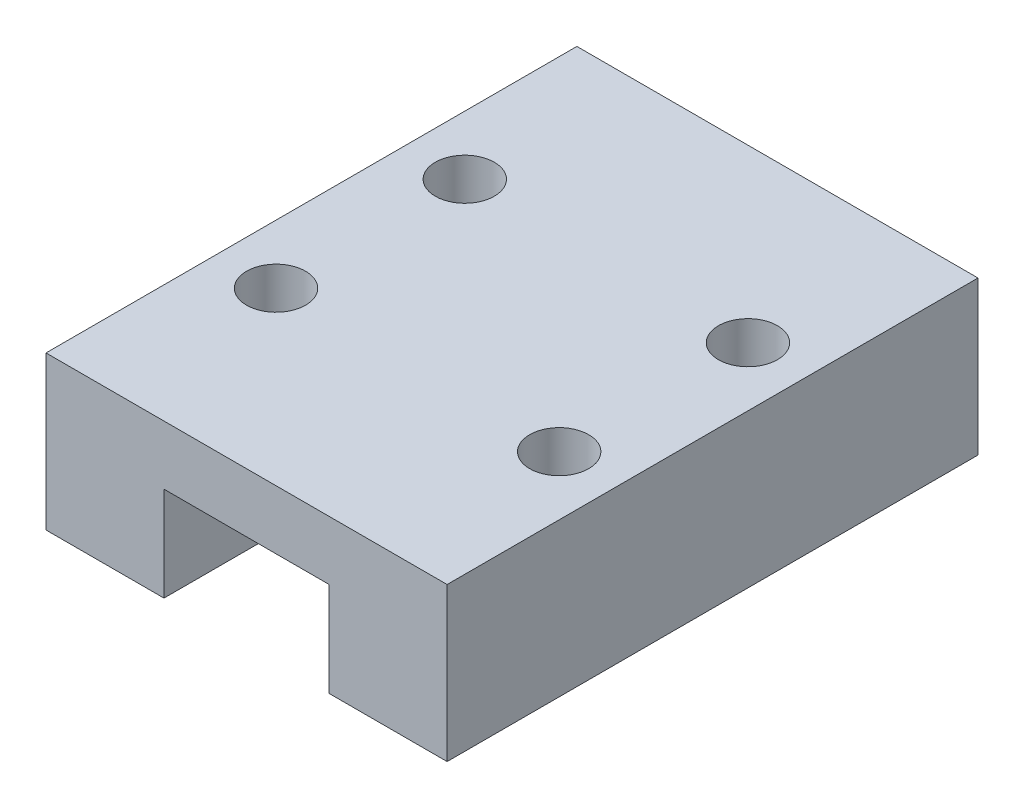
ISO-10303-21;
HEADER;
FILE_DESCRIPTION(('STEP AP214'),'2;1');
FILE_NAME('part.step','',(''),(''),'','','');
FILE_SCHEMA(('AUTOMOTIVE_DESIGN { 1 0 10303 214 1 1 1 1 }'));
ENDSEC;
DATA;
#1=APPLICATION_CONTEXT('core data for automotive mechanical design processes');
#2=APPLICATION_PROTOCOL_DEFINITION('international standard','automotive_design',2000,#1);
#3=PRODUCT_CONTEXT('',#1,'mechanical');
#4=PRODUCT('Part','Part','',(#3));
#5=PRODUCT_RELATED_PRODUCT_CATEGORY('part','',(#4));
#6=PRODUCT_DEFINITION_FORMATION('','',#4);
#7=PRODUCT_DEFINITION_CONTEXT('part definition',#1,'design');
#8=PRODUCT_DEFINITION('design','',#6,#7);
#9=PRODUCT_DEFINITION_SHAPE('','',#8);
#10=(LENGTH_UNIT() NAMED_UNIT(*) SI_UNIT(.MILLI.,.METRE.));
#11=(NAMED_UNIT(*) PLANE_ANGLE_UNIT() SI_UNIT($,.RADIAN.));
#12=(NAMED_UNIT(*) SI_UNIT($,.STERADIAN.) SOLID_ANGLE_UNIT());
#13=UNCERTAINTY_MEASURE_WITH_UNIT(LENGTH_MEASURE(1.E-05),#10,'distance_accuracy_value','');
#14=(GEOMETRIC_REPRESENTATION_CONTEXT(3) GLOBAL_UNCERTAINTY_ASSIGNED_CONTEXT((#13)) GLOBAL_UNIT_ASSIGNED_CONTEXT((#10,
#11,#12)) REPRESENTATION_CONTEXT('',''));
#15=CARTESIAN_POINT('',(0.,0.,0.));
#16=DIRECTION('',(0.,0.,1.));
#17=DIRECTION('',(1.,0.,0.));
#18=AXIS2_PLACEMENT_3D('',#15,#16,#17);
#19=CARTESIAN_POINT('',(0.,0.,22.5));
#20=DIRECTION('',(1.,0.,0.));
#21=DIRECTION('',(0.,0.,-1.));
#22=AXIS2_PLACEMENT_3D('',#19,#20,#21);
#23=PLANE('',#22);
#24=DIRECTION('',(0.,-1.,0.));
#25=VECTOR('',#24,1.);
#26=CARTESIAN_POINT('',(0.,0.,0.));
#27=LINE('',#26,#25);
#28=CARTESIAN_POINT('',(0.,6.5,0.));
#29=VERTEX_POINT('',#28);
#30=CARTESIAN_POINT('',(0.,0.,0.));
#31=VERTEX_POINT('',#30);
#32=EDGE_CURVE('E129',#29,#31,#27,.T.);
#33=ORIENTED_EDGE('',*,*,#32,.T.);
#34=DIRECTION('',(0.,0.,-1.));
#35=VECTOR('',#34,1.);
#36=CARTESIAN_POINT('',(0.,0.,22.5));
#37=LINE('',#36,#35);
#38=CARTESIAN_POINT('',(0.,0.,22.5));
#39=VERTEX_POINT('',#38);
#40=EDGE_CURVE('E11',#39,#31,#37,.T.);
#41=ORIENTED_EDGE('',*,*,#40,.F.);
#42=DIRECTION('',(0.,-1.,0.));
#43=VECTOR('',#42,1.);
#44=CARTESIAN_POINT('',(0.,0.,22.5));
#45=LINE('',#44,#43);
#46=CARTESIAN_POINT('',(0.,6.5,22.5));
#47=VERTEX_POINT('',#46);
#48=EDGE_CURVE('E144',#47,#39,#45,.T.);
#49=ORIENTED_EDGE('',*,*,#48,.F.);
#50=DIRECTION('',(0.,0.,-1.));
#51=VECTOR('',#50,1.);
#52=CARTESIAN_POINT('',(0.,6.5,22.5));
#53=LINE('',#52,#51);
#54=EDGE_CURVE('E125',#47,#29,#53,.T.);
#55=ORIENTED_EDGE('',*,*,#54,.T.);
#56=EDGE_LOOP('',(#33,#41,#49,#55));
#57=FACE_BOUND('',#56,.T.);
#58=ADVANCED_FACE('F33',(#57),#23,.F.);
#59=CARTESIAN_POINT('',(0.,0.,22.5));
#60=DIRECTION('',(0.,1.,0.));
#61=DIRECTION('',(0.,0.,1.));
#62=AXIS2_PLACEMENT_3D('',#59,#60,#61);
#63=PLANE('',#62);
#64=DIRECTION('',(1.,0.,0.));
#65=VECTOR('',#64,1.);
#66=CARTESIAN_POINT('',(0.,0.,0.));
#67=LINE('',#66,#65);
#68=CARTESIAN_POINT('',(5.,0.,0.));
#69=VERTEX_POINT('',#68);
#70=EDGE_CURVE('E132',#31,#69,#67,.T.);
#71=ORIENTED_EDGE('',*,*,#70,.T.);
#72=DIRECTION('',(0.,0.,-1.));
#73=VECTOR('',#72,1.);
#74=CARTESIAN_POINT('',(5.,0.,22.5));
#75=LINE('',#74,#73);
#76=CARTESIAN_POINT('',(5.,0.,22.5));
#77=VERTEX_POINT('',#76);
#78=EDGE_CURVE('E41',#77,#69,#75,.T.);
#79=ORIENTED_EDGE('',*,*,#78,.F.);
#80=DIRECTION('',(1.,0.,0.));
#81=VECTOR('',#80,1.);
#82=CARTESIAN_POINT('',(0.,0.,22.5));
#83=LINE('',#82,#81);
#84=EDGE_CURVE('E92',#39,#77,#83,.T.);
#85=ORIENTED_EDGE('',*,*,#84,.F.);
#86=ORIENTED_EDGE('',*,*,#40,.T.);
#87=EDGE_LOOP('',(#71,#79,#85,#86));
#88=FACE_BOUND('',#87,.T.);
#89=ADVANCED_FACE('F236',(#88),#63,.F.);
#90=CARTESIAN_POINT('',(5.,0.,22.5));
#91=DIRECTION('',(-1.,0.,0.));
#92=DIRECTION('',(0.,0.,1.));
#93=AXIS2_PLACEMENT_3D('',#90,#91,#92);
#94=PLANE('',#93);
#95=DIRECTION('',(0.,1.,0.));
#96=VECTOR('',#95,1.);
#97=CARTESIAN_POINT('',(5.,0.,0.));
#98=LINE('',#97,#96);
#99=CARTESIAN_POINT('',(5.,4.,0.));
#100=VERTEX_POINT('',#99);
#101=EDGE_CURVE('E135',#69,#100,#98,.T.);
#102=ORIENTED_EDGE('',*,*,#101,.T.);
#103=DIRECTION('',(0.,0.,-1.));
#104=VECTOR('',#103,1.);
#105=CARTESIAN_POINT('',(5.,4.,22.5));
#106=LINE('',#105,#104);
#107=CARTESIAN_POINT('',(5.,4.,22.5));
#108=VERTEX_POINT('',#107);
#109=EDGE_CURVE('E151',#108,#100,#106,.T.);
#110=ORIENTED_EDGE('',*,*,#109,.F.);
#111=DIRECTION('',(0.,1.,0.));
#112=VECTOR('',#111,1.);
#113=CARTESIAN_POINT('',(5.,0.,22.5));
#114=LINE('',#113,#112);
#115=EDGE_CURVE('E159',#77,#108,#114,.T.);
#116=ORIENTED_EDGE('',*,*,#115,.F.);
#117=ORIENTED_EDGE('',*,*,#78,.T.);
#118=EDGE_LOOP('',(#102,#110,#116,#117));
#119=FACE_BOUND('',#118,.T.);
#120=ADVANCED_FACE('F157',(#119),#94,.F.);
#121=CARTESIAN_POINT('',(5.,4.,22.5));
#122=DIRECTION('',(0.,1.,0.));
#123=DIRECTION('',(0.,0.,1.));
#124=AXIS2_PLACEMENT_3D('',#121,#122,#123);
#125=PLANE('',#124);
#126=DIRECTION('',(1.,0.,0.));
#127=VECTOR('',#126,1.);
#128=CARTESIAN_POINT('',(5.,4.,0.));
#129=LINE('',#128,#127);
#130=CARTESIAN_POINT('',(12.,4.,0.));
#131=VERTEX_POINT('',#130);
#132=EDGE_CURVE('E137',#100,#131,#129,.T.);
#133=ORIENTED_EDGE('',*,*,#132,.T.);
#134=DIRECTION('',(0.,0.,-1.));
#135=VECTOR('',#134,1.);
#136=CARTESIAN_POINT('',(12.,4.,22.5));
#137=LINE('',#136,#135);
#138=CARTESIAN_POINT('',(12.,4.,22.5));
#139=VERTEX_POINT('',#138);
#140=EDGE_CURVE('E148',#139,#131,#137,.T.);
#141=ORIENTED_EDGE('',*,*,#140,.F.);
#142=DIRECTION('',(1.,0.,0.));
#143=VECTOR('',#142,1.);
#144=CARTESIAN_POINT('',(5.,4.,22.5));
#145=LINE('',#144,#143);
#146=EDGE_CURVE('E171',#108,#139,#145,.T.);
#147=ORIENTED_EDGE('',*,*,#146,.F.);
#148=ORIENTED_EDGE('',*,*,#109,.T.);
#149=EDGE_LOOP('',(#133,#141,#147,#148));
#150=FACE_BOUND('',#149,.T.);
#151=ADVANCED_FACE('F167',(#150),#125,.F.);
#152=CARTESIAN_POINT('',(12.,0.,22.5));
#153=DIRECTION('',(1.,0.,0.));
#154=DIRECTION('',(0.,0.,-1.));
#155=AXIS2_PLACEMENT_3D('',#152,#153,#154);
#156=PLANE('',#155);
#157=DIRECTION('',(0.,-1.,0.));
#158=VECTOR('',#157,1.);
#159=CARTESIAN_POINT('',(12.,0.,0.));
#160=LINE('',#159,#158);
#161=CARTESIAN_POINT('',(12.,0.,0.));
#162=VERTEX_POINT('',#161);
#163=EDGE_CURVE('E139',#131,#162,#160,.T.);
#164=ORIENTED_EDGE('',*,*,#163,.T.);
#165=DIRECTION('',(0.,0.,-1.));
#166=VECTOR('',#165,1.);
#167=CARTESIAN_POINT('',(12.,0.,22.5));
#168=LINE('',#167,#166);
#169=CARTESIAN_POINT('',(12.,0.,22.5));
#170=VERTEX_POINT('',#169);
#171=EDGE_CURVE('E120',#170,#162,#168,.T.);
#172=ORIENTED_EDGE('',*,*,#171,.F.);
#173=DIRECTION('',(0.,-1.,0.));
#174=VECTOR('',#173,1.);
#175=CARTESIAN_POINT('',(12.,0.,22.5));
#176=LINE('',#175,#174);
#177=EDGE_CURVE('E111',#139,#170,#176,.T.);
#178=ORIENTED_EDGE('',*,*,#177,.F.);
#179=ORIENTED_EDGE('',*,*,#140,.T.);
#180=EDGE_LOOP('',(#164,#172,#178,#179));
#181=FACE_BOUND('',#180,.T.);
#182=ADVANCED_FACE('F170',(#181),#156,.F.);
#183=CARTESIAN_POINT('',(12.,0.,22.5));
#184=DIRECTION('',(0.,1.,0.));
#185=DIRECTION('',(0.,0.,1.));
#186=AXIS2_PLACEMENT_3D('',#183,#184,#185);
#187=PLANE('',#186);
#188=DIRECTION('',(1.,0.,0.));
#189=VECTOR('',#188,1.);
#190=CARTESIAN_POINT('',(12.,0.,0.));
#191=LINE('',#190,#189);
#192=CARTESIAN_POINT('',(17.,0.,0.));
#193=VERTEX_POINT('',#192);
#194=EDGE_CURVE('E119',#162,#193,#191,.T.);
#195=ORIENTED_EDGE('',*,*,#194,.T.);
#196=DIRECTION('',(0.,0.,-1.));
#197=VECTOR('',#196,1.);
#198=CARTESIAN_POINT('',(17.,0.,22.5));
#199=LINE('',#198,#197);
#200=CARTESIAN_POINT('',(17.,0.,22.5));
#201=VERTEX_POINT('',#200);
#202=EDGE_CURVE('E116',#201,#193,#199,.T.);
#203=ORIENTED_EDGE('',*,*,#202,.F.);
#204=DIRECTION('',(1.,0.,0.));
#205=VECTOR('',#204,1.);
#206=CARTESIAN_POINT('',(12.,0.,22.5));
#207=LINE('',#206,#205);
#208=EDGE_CURVE('E105',#170,#201,#207,.T.);
#209=ORIENTED_EDGE('',*,*,#208,.F.);
#210=ORIENTED_EDGE('',*,*,#171,.T.);
#211=EDGE_LOOP('',(#195,#203,#209,#210));
#212=FACE_BOUND('',#211,.T.);
#213=ADVANCED_FACE('F117',(#212),#187,.F.);
#214=CARTESIAN_POINT('',(17.,0.,22.5));
#215=DIRECTION('',(-1.,0.,0.));
#216=DIRECTION('',(0.,0.,1.));
#217=AXIS2_PLACEMENT_3D('',#214,#215,#216);
#218=PLANE('',#217);
#219=DIRECTION('',(0.,1.,0.));
#220=VECTOR('',#219,1.);
#221=CARTESIAN_POINT('',(17.,0.,0.));
#222=LINE('',#221,#220);
#223=CARTESIAN_POINT('',(17.,6.5,0.));
#224=VERTEX_POINT('',#223);
#225=EDGE_CURVE('E78',#193,#224,#222,.T.);
#226=ORIENTED_EDGE('',*,*,#225,.T.);
#227=DIRECTION('',(0.,0.,-1.));
#228=VECTOR('',#227,1.);
#229=CARTESIAN_POINT('',(17.,6.5,22.5));
#230=LINE('',#229,#228);
#231=CARTESIAN_POINT('',(17.,6.5,22.5));
#232=VERTEX_POINT('',#231);
#233=EDGE_CURVE('E121',#232,#224,#230,.T.);
#234=ORIENTED_EDGE('',*,*,#233,.F.);
#235=DIRECTION('',(0.,1.,0.));
#236=VECTOR('',#235,1.);
#237=CARTESIAN_POINT('',(17.,0.,22.5));
#238=LINE('',#237,#236);
#239=EDGE_CURVE('E109',#201,#232,#238,.T.);
#240=ORIENTED_EDGE('',*,*,#239,.F.);
#241=ORIENTED_EDGE('',*,*,#202,.T.);
#242=EDGE_LOOP('',(#226,#234,#240,#241));
#243=FACE_BOUND('',#242,.T.);
#244=ADVANCED_FACE('F123',(#243),#218,.F.);
#245=CARTESIAN_POINT('',(0.,6.5,22.5));
#246=DIRECTION('',(0.,-1.,0.));
#247=DIRECTION('',(0.,0.,-1.));
#248=AXIS2_PLACEMENT_3D('',#245,#246,#247);
#249=PLANE('',#248);
#250=CARTESIAN_POINT('',(14.5,6.5,15.25));
#251=DIRECTION('',(0.,1.,0.));
#252=DIRECTION('',(0.,0.,1.));
#253=AXIS2_PLACEMENT_3D('',#250,#251,#252);
#254=CIRCLE('',#253,1.25);
#255=CARTESIAN_POINT('',(14.5,6.5,16.5));
#256=VERTEX_POINT('',#255);
#257=EDGE_CURVE('E195',#256,#256,#254,.T.);
#258=ORIENTED_EDGE('',*,*,#257,.F.);
#259=EDGE_LOOP('',(#258));
#260=FACE_BOUND('',#259,.T.);
#261=CARTESIAN_POINT('',(2.5,6.5,15.25));
#262=DIRECTION('',(0.,1.,0.));
#263=DIRECTION('',(0.,0.,1.));
#264=AXIS2_PLACEMENT_3D('',#261,#262,#263);
#265=CIRCLE('',#264,1.25);
#266=CARTESIAN_POINT('',(2.5,6.5,16.5));
#267=VERTEX_POINT('',#266);
#268=EDGE_CURVE('E189',#267,#267,#265,.T.);
#269=ORIENTED_EDGE('',*,*,#268,.F.);
#270=EDGE_LOOP('',(#269));
#271=FACE_BOUND('',#270,.T.);
#272=CARTESIAN_POINT('',(2.5,6.5,7.25));
#273=DIRECTION('',(0.,1.,0.));
#274=DIRECTION('',(0.,0.,1.));
#275=AXIS2_PLACEMENT_3D('',#272,#273,#274);
#276=CIRCLE('',#275,1.25);
#277=CARTESIAN_POINT('',(2.5,6.5,8.5));
#278=VERTEX_POINT('',#277);
#279=EDGE_CURVE('E183',#278,#278,#276,.T.);
#280=ORIENTED_EDGE('',*,*,#279,.F.);
#281=EDGE_LOOP('',(#280));
#282=FACE_BOUND('',#281,.T.);
#283=CARTESIAN_POINT('',(14.5,6.5,7.25));
#284=DIRECTION('',(0.,1.,0.));
#285=DIRECTION('',(0.,0.,1.));
#286=AXIS2_PLACEMENT_3D('',#283,#284,#285);
#287=CIRCLE('',#286,1.25);
#288=CARTESIAN_POINT('',(14.5,6.5,8.5));
#289=VERTEX_POINT('',#288);
#290=EDGE_CURVE('E177',#289,#289,#287,.T.);
#291=ORIENTED_EDGE('',*,*,#290,.F.);
#292=EDGE_LOOP('',(#291));
#293=FACE_BOUND('',#292,.T.);
#294=DIRECTION('',(-1.,0.,0.));
#295=VECTOR('',#294,1.);
#296=CARTESIAN_POINT('',(0.,6.5,0.));
#297=LINE('',#296,#295);
#298=EDGE_CURVE('E84',#224,#29,#297,.T.);
#299=ORIENTED_EDGE('',*,*,#298,.T.);
#300=ORIENTED_EDGE('',*,*,#54,.F.);
#301=DIRECTION('',(-1.,0.,0.));
#302=VECTOR('',#301,1.);
#303=CARTESIAN_POINT('',(0.,6.5,22.5));
#304=LINE('',#303,#302);
#305=EDGE_CURVE('E49',#232,#47,#304,.T.);
#306=ORIENTED_EDGE('',*,*,#305,.F.);
#307=ORIENTED_EDGE('',*,*,#233,.T.);
#308=EDGE_LOOP('',(#299,#300,#306,#307));
#309=FACE_BOUND('',#308,.T.);
#310=ADVANCED_FACE('F210',(#260,#271,#282,#293,#309),#249,.F.);
#311=CARTESIAN_POINT('',(0.,0.,22.5));
#312=DIRECTION('',(0.,0.,-1.));
#313=DIRECTION('',(-1.,0.,0.));
#314=AXIS2_PLACEMENT_3D('',#311,#312,#313);
#315=PLANE('',#314);
#316=ORIENTED_EDGE('',*,*,#48,.T.);
#317=ORIENTED_EDGE('',*,*,#84,.T.);
#318=ORIENTED_EDGE('',*,*,#115,.T.);
#319=ORIENTED_EDGE('',*,*,#146,.T.);
#320=ORIENTED_EDGE('',*,*,#177,.T.);
#321=ORIENTED_EDGE('',*,*,#208,.T.);
#322=ORIENTED_EDGE('',*,*,#239,.T.);
#323=ORIENTED_EDGE('',*,*,#305,.T.);
#324=EDGE_LOOP('',(#316,#317,#318,#319,#320,#321,#322,#323));
#325=FACE_BOUND('',#324,.T.);
#326=ADVANCED_FACE('F107',(#325),#315,.F.);
#327=CARTESIAN_POINT('',(0.,0.,0.));
#328=DIRECTION('',(0.,0.,-1.));
#329=DIRECTION('',(-1.,0.,0.));
#330=AXIS2_PLACEMENT_3D('',#327,#328,#329);
#331=PLANE('',#330);
#332=ORIENTED_EDGE('',*,*,#32,.F.);
#333=ORIENTED_EDGE('',*,*,#298,.F.);
#334=ORIENTED_EDGE('',*,*,#225,.F.);
#335=ORIENTED_EDGE('',*,*,#194,.F.);
#336=ORIENTED_EDGE('',*,*,#163,.F.);
#337=ORIENTED_EDGE('',*,*,#132,.F.);
#338=ORIENTED_EDGE('',*,*,#101,.F.);
#339=ORIENTED_EDGE('',*,*,#70,.F.);
#340=EDGE_LOOP('',(#332,#333,#334,#335,#336,#337,#338,#339));
#341=FACE_BOUND('',#340,.T.);
#342=ADVANCED_FACE('F163',(#341),#331,.T.);
#343=CARTESIAN_POINT('',(14.5,3.5,7.25));
#344=DIRECTION('',(0.,1.,0.));
#345=DIRECTION('',(0.,0.,1.));
#346=AXIS2_PLACEMENT_3D('',#343,#344,#345);
#347=CYLINDRICAL_SURFACE('',#346,1.25);
#348=CARTESIAN_POINT('',(14.5,3.5,7.25));
#349=DIRECTION('',(0.,1.,0.));
#350=DIRECTION('',(0.,0.,1.));
#351=AXIS2_PLACEMENT_3D('',#348,#349,#350);
#352=CIRCLE('',#351,1.25);
#353=CARTESIAN_POINT('',(14.5,3.5,8.5));
#354=VERTEX_POINT('',#353);
#355=EDGE_CURVE('E133',#354,#354,#352,.T.);
#356=ORIENTED_EDGE('',*,*,#355,.F.);
#357=EDGE_LOOP('',(#356));
#358=FACE_BOUND('',#357,.T.);
#359=ORIENTED_EDGE('',*,*,#290,.T.);
#360=EDGE_LOOP('',(#359));
#361=FACE_BOUND('',#360,.T.);
#362=ADVANCED_FACE('F220',(#358,#361),#347,.F.);
#363=CARTESIAN_POINT('',(14.5,3.5,7.25));
#364=DIRECTION('',(0.,1.,0.));
#365=DIRECTION('',(0.,0.,1.));
#366=AXIS2_PLACEMENT_3D('',#363,#364,#365);
#367=PLANE('',#366);
#368=ORIENTED_EDGE('',*,*,#355,.T.);
#369=EDGE_LOOP('',(#368));
#370=FACE_BOUND('',#369,.T.);
#371=ADVANCED_FACE('F222',(#370),#367,.T.);
#372=CARTESIAN_POINT('',(2.5,3.5,7.25));
#373=DIRECTION('',(0.,1.,0.));
#374=DIRECTION('',(0.,0.,1.));
#375=AXIS2_PLACEMENT_3D('',#372,#373,#374);
#376=CYLINDRICAL_SURFACE('',#375,1.25);
#377=CARTESIAN_POINT('',(2.5,3.5,7.25));
#378=DIRECTION('',(0.,1.,0.));
#379=DIRECTION('',(0.,0.,1.));
#380=AXIS2_PLACEMENT_3D('',#377,#378,#379);
#381=CIRCLE('',#380,1.25);
#382=CARTESIAN_POINT('',(2.5,3.5,8.5));
#383=VERTEX_POINT('',#382);
#384=EDGE_CURVE('E180',#383,#383,#381,.T.);
#385=ORIENTED_EDGE('',*,*,#384,.F.);
#386=EDGE_LOOP('',(#385));
#387=FACE_BOUND('',#386,.T.);
#388=ORIENTED_EDGE('',*,*,#279,.T.);
#389=EDGE_LOOP('',(#388));
#390=FACE_BOUND('',#389,.T.);
#391=ADVANCED_FACE('F229',(#387,#390),#376,.F.);
#392=CARTESIAN_POINT('',(2.5,3.5,7.25));
#393=DIRECTION('',(0.,1.,0.));
#394=DIRECTION('',(0.,0.,1.));
#395=AXIS2_PLACEMENT_3D('',#392,#393,#394);
#396=PLANE('',#395);
#397=ORIENTED_EDGE('',*,*,#384,.T.);
#398=EDGE_LOOP('',(#397));
#399=FACE_BOUND('',#398,.T.);
#400=ADVANCED_FACE('F289',(#399),#396,.T.);
#401=CARTESIAN_POINT('',(2.5,3.5,15.25));
#402=DIRECTION('',(0.,1.,0.));
#403=DIRECTION('',(0.,0.,1.));
#404=AXIS2_PLACEMENT_3D('',#401,#402,#403);
#405=CYLINDRICAL_SURFACE('',#404,1.25);
#406=CARTESIAN_POINT('',(2.5,3.5,15.25));
#407=DIRECTION('',(0.,1.,0.));
#408=DIRECTION('',(0.,0.,1.));
#409=AXIS2_PLACEMENT_3D('',#406,#407,#408);
#410=CIRCLE('',#409,1.25);
#411=CARTESIAN_POINT('',(2.5,3.5,16.5));
#412=VERTEX_POINT('',#411);
#413=EDGE_CURVE('E186',#412,#412,#410,.T.);
#414=ORIENTED_EDGE('',*,*,#413,.F.);
#415=EDGE_LOOP('',(#414));
#416=FACE_BOUND('',#415,.T.);
#417=ORIENTED_EDGE('',*,*,#268,.T.);
#418=EDGE_LOOP('',(#417));
#419=FACE_BOUND('',#418,.T.);
#420=ADVANCED_FACE('F299',(#416,#419),#405,.F.);
#421=CARTESIAN_POINT('',(2.5,3.5,15.25));
#422=DIRECTION('',(0.,1.,0.));
#423=DIRECTION('',(0.,0.,1.));
#424=AXIS2_PLACEMENT_3D('',#421,#422,#423);
#425=PLANE('',#424);
#426=ORIENTED_EDGE('',*,*,#413,.T.);
#427=EDGE_LOOP('',(#426));
#428=FACE_BOUND('',#427,.T.);
#429=ADVANCED_FACE('F206',(#428),#425,.T.);
#430=CARTESIAN_POINT('',(14.5,3.5,15.25));
#431=DIRECTION('',(0.,1.,0.));
#432=DIRECTION('',(0.,0.,1.));
#433=AXIS2_PLACEMENT_3D('',#430,#431,#432);
#434=CYLINDRICAL_SURFACE('',#433,1.25);
#435=CARTESIAN_POINT('',(14.5,3.5,15.25));
#436=DIRECTION('',(0.,1.,0.));
#437=DIRECTION('',(0.,0.,1.));
#438=AXIS2_PLACEMENT_3D('',#435,#436,#437);
#439=CIRCLE('',#438,1.25);
#440=CARTESIAN_POINT('',(14.5,3.5,16.5));
#441=VERTEX_POINT('',#440);
#442=EDGE_CURVE('E192',#441,#441,#439,.T.);
#443=ORIENTED_EDGE('',*,*,#442,.F.);
#444=EDGE_LOOP('',(#443));
#445=FACE_BOUND('',#444,.T.);
#446=ORIENTED_EDGE('',*,*,#257,.T.);
#447=EDGE_LOOP('',(#446));
#448=FACE_BOUND('',#447,.T.);
#449=ADVANCED_FACE('F203',(#445,#448),#434,.F.);
#450=CARTESIAN_POINT('',(14.5,3.5,15.25));
#451=DIRECTION('',(0.,1.,0.));
#452=DIRECTION('',(0.,0.,1.));
#453=AXIS2_PLACEMENT_3D('',#450,#451,#452);
#454=PLANE('',#453);
#455=ORIENTED_EDGE('',*,*,#442,.T.);
#456=EDGE_LOOP('',(#455));
#457=FACE_BOUND('',#456,.T.);
#458=ADVANCED_FACE('F201',(#457),#454,.T.);
#459=CLOSED_SHELL('',(#58,#89,#120,#151,#182,#213,#244,#310,#326,#342,#362,#371,#391,#400,#420,
#429,#449,#458));
#460=MANIFOLD_SOLID_BREP('B2',#459);
#461=ADVANCED_BREP_SHAPE_REPRESENTATION('',(#18,#460),#14);
#462=SHAPE_DEFINITION_REPRESENTATION(#9,#461);
ENDSEC;
END-ISO-10303-21;
